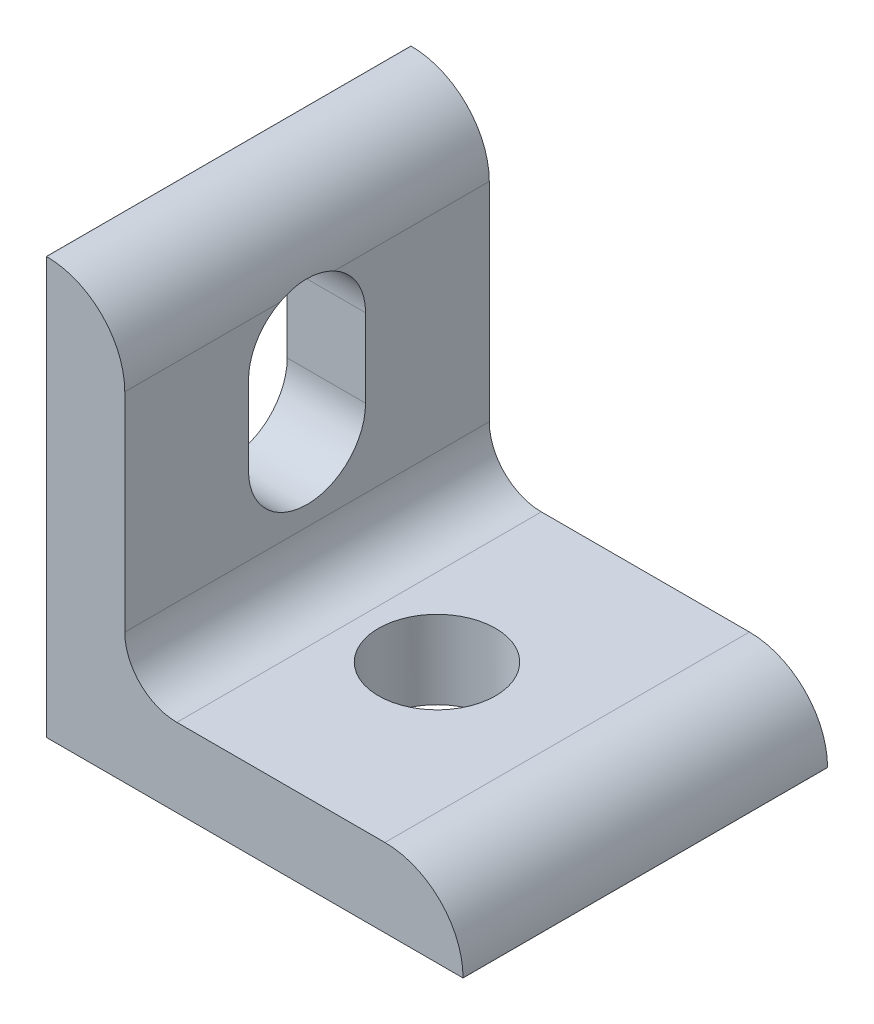
ISO-10303-21;
HEADER;
FILE_DESCRIPTION(('STEP AP214'),'2;1');
FILE_NAME('part.step','',(''),(''),'','','');
FILE_SCHEMA(('AUTOMOTIVE_DESIGN { 1 0 10303 214 1 1 1 1 }'));
ENDSEC;
DATA;
#1=APPLICATION_CONTEXT('core data for automotive mechanical design processes');
#2=APPLICATION_PROTOCOL_DEFINITION('international standard','automotive_design',2000,#1);
#3=PRODUCT_CONTEXT('',#1,'mechanical');
#4=PRODUCT('Part','Part','',(#3));
#5=PRODUCT_RELATED_PRODUCT_CATEGORY('part','',(#4));
#6=PRODUCT_DEFINITION_FORMATION('','',#4);
#7=PRODUCT_DEFINITION_CONTEXT('part definition',#1,'design');
#8=PRODUCT_DEFINITION('design','',#6,#7);
#9=PRODUCT_DEFINITION_SHAPE('','',#8);
#10=(LENGTH_UNIT() NAMED_UNIT(*) SI_UNIT(.MILLI.,.METRE.));
#11=(NAMED_UNIT(*) PLANE_ANGLE_UNIT() SI_UNIT($,.RADIAN.));
#12=(NAMED_UNIT(*) SI_UNIT($,.STERADIAN.) SOLID_ANGLE_UNIT());
#13=UNCERTAINTY_MEASURE_WITH_UNIT(LENGTH_MEASURE(1.E-05),#10,'distance_accuracy_value','');
#14=(GEOMETRIC_REPRESENTATION_CONTEXT(3) GLOBAL_UNCERTAINTY_ASSIGNED_CONTEXT((#13)) GLOBAL_UNIT_ASSIGNED_CONTEXT((#10,
#11,#12)) REPRESENTATION_CONTEXT('',''));
#15=CARTESIAN_POINT('',(0.,0.,0.));
#16=DIRECTION('',(0.,0.,1.));
#17=DIRECTION('',(1.,0.,0.));
#18=AXIS2_PLACEMENT_3D('',#15,#16,#17);
#19=CARTESIAN_POINT('',(25.4,0.,11.1125));
#20=DIRECTION('',(0.,1.,0.));
#21=DIRECTION('',(-1.,0.,0.));
#22=AXIS2_PLACEMENT_3D('',#19,#20,#21);
#23=PLANE('',#22);
#24=CARTESIAN_POINT('',(12.7,0.,0.));
#25=DIRECTION('',(0.,-1.,0.));
#26=DIRECTION('',(1.,0.,0.));
#27=AXIS2_PLACEMENT_3D('',#24,#25,#26);
#28=CIRCLE('',#27,3.5687);
#29=CARTESIAN_POINT('',(16.2687,0.,0.));
#30=VERTEX_POINT('',#29);
#31=EDGE_CURVE('E215',#30,#30,#28,.T.);
#32=ORIENTED_EDGE('',*,*,#31,.F.);
#33=EDGE_LOOP('',(#32));
#34=FACE_BOUND('',#33,.T.);
#35=DIRECTION('',(1.,0.,0.));
#36=VECTOR('',#35,1.);
#37=CARTESIAN_POINT('',(25.4,0.,-11.1125));
#38=LINE('',#37,#36);
#39=CARTESIAN_POINT('',(0.,0.,-11.1125));
#40=VERTEX_POINT('',#39);
#41=CARTESIAN_POINT('',(25.4,0.,-11.1125));
#42=VERTEX_POINT('',#41);
#43=EDGE_CURVE('E182',#40,#42,#38,.T.);
#44=ORIENTED_EDGE('',*,*,#43,.T.);
#45=DIRECTION('',(0.,0.,-1.));
#46=VECTOR('',#45,1.);
#47=CARTESIAN_POINT('',(25.4,0.,11.1125));
#48=LINE('',#47,#46);
#49=CARTESIAN_POINT('',(25.4,0.,11.1125));
#50=VERTEX_POINT('',#49);
#51=EDGE_CURVE('E11',#50,#42,#48,.T.);
#52=ORIENTED_EDGE('',*,*,#51,.F.);
#53=DIRECTION('',(1.,0.,0.));
#54=VECTOR('',#53,1.);
#55=CARTESIAN_POINT('',(25.4,0.,11.1125));
#56=LINE('',#55,#54);
#57=CARTESIAN_POINT('',(0.,0.,11.1125));
#58=VERTEX_POINT('',#57);
#59=EDGE_CURVE('E183',#58,#50,#56,.T.);
#60=ORIENTED_EDGE('',*,*,#59,.F.);
#61=DIRECTION('',(0.,0.,-1.));
#62=VECTOR('',#61,1.);
#63=CARTESIAN_POINT('',(0.,0.,11.1125));
#64=LINE('',#63,#62);
#65=EDGE_CURVE('E222',#58,#40,#64,.T.);
#66=ORIENTED_EDGE('',*,*,#65,.T.);
#67=EDGE_LOOP('',(#44,#52,#60,#66));
#68=FACE_BOUND('',#67,.T.);
#69=ADVANCED_FACE('F34',(#34,#68),#23,.F.);
#70=CARTESIAN_POINT('',(25.4,0.0126999999999636,11.1125));
#71=DIRECTION('',(-1.,0.,0.));
#72=DIRECTION('',(0.,0.,1.));
#73=AXIS2_PLACEMENT_3D('',#70,#71,#72);
#74=PLANE('',#73);
#75=DIRECTION('',(0.,1.,0.));
#76=VECTOR('',#75,1.);
#77=CARTESIAN_POINT('',(25.4,0.0126999999999636,-11.1125));
#78=LINE('',#77,#76);
#79=CARTESIAN_POINT('',(25.4,0.0126999999999642,-11.1125));
#80=VERTEX_POINT('',#79);
#81=EDGE_CURVE('E225',#42,#80,#78,.T.);
#82=ORIENTED_EDGE('',*,*,#81,.T.);
#83=DIRECTION('',(0.,0.,-1.));
#84=VECTOR('',#83,1.);
#85=CARTESIAN_POINT('',(25.4,0.0126999999999642,11.1125));
#86=LINE('',#85,#84);
#87=CARTESIAN_POINT('',(25.4,0.0126999999999642,11.1125));
#88=VERTEX_POINT('',#87);
#89=EDGE_CURVE('E42',#88,#80,#86,.T.);
#90=ORIENTED_EDGE('',*,*,#89,.F.);
#91=DIRECTION('',(0.,1.,0.));
#92=VECTOR('',#91,1.);
#93=CARTESIAN_POINT('',(25.4,0.0126999999999636,11.1125));
#94=LINE('',#93,#92);
#95=EDGE_CURVE('E303',#50,#88,#94,.T.);
#96=ORIENTED_EDGE('',*,*,#95,.F.);
#97=ORIENTED_EDGE('',*,*,#51,.T.);
#98=EDGE_LOOP('',(#82,#90,#96,#97));
#99=FACE_BOUND('',#98,.T.);
#100=ADVANCED_FACE('F205',(#99),#74,.F.);
#101=CARTESIAN_POINT('',(20.6375,0.0126999999999974,11.1125));
#102=DIRECTION('',(0.,0.,-1.));
#103=DIRECTION('',(-1.,0.,0.));
#104=AXIS2_PLACEMENT_3D('',#101,#102,#103);
#105=CYLINDRICAL_SURFACE('',#104,4.7625);
#106=CARTESIAN_POINT('',(20.6375,0.0126999999999974,-11.1125));
#107=DIRECTION('',(0.,0.,1.));
#108=DIRECTION('',(-1.,0.,0.));
#109=AXIS2_PLACEMENT_3D('',#106,#107,#108);
#110=CIRCLE('',#109,4.7625);
#111=CARTESIAN_POINT('',(20.6375,4.7752,-11.1125));
#112=VERTEX_POINT('',#111);
#113=EDGE_CURVE('E227',#80,#112,#110,.T.);
#114=ORIENTED_EDGE('',*,*,#113,.T.);
#115=DIRECTION('',(0.,0.,-1.));
#116=VECTOR('',#115,1.);
#117=CARTESIAN_POINT('',(20.6375,4.7752,11.1125));
#118=LINE('',#117,#116);
#119=CARTESIAN_POINT('',(20.6375,4.7752,11.1125));
#120=VERTEX_POINT('',#119);
#121=EDGE_CURVE('E262',#120,#112,#118,.T.);
#122=ORIENTED_EDGE('',*,*,#121,.F.);
#123=CARTESIAN_POINT('',(20.6375,0.0126999999999974,11.1125));
#124=DIRECTION('',(0.,0.,1.));
#125=DIRECTION('',(-1.,0.,0.));
#126=AXIS2_PLACEMENT_3D('',#123,#124,#125);
#127=CIRCLE('',#126,4.7625);
#128=EDGE_CURVE('E271',#88,#120,#127,.T.);
#129=ORIENTED_EDGE('',*,*,#128,.F.);
#130=ORIENTED_EDGE('',*,*,#89,.T.);
#131=EDGE_LOOP('',(#114,#122,#129,#130));
#132=FACE_BOUND('',#131,.T.);
#133=ADVANCED_FACE('F210',(#132),#105,.T.);
#134=CARTESIAN_POINT('',(7.9502,4.7752,11.1125));
#135=DIRECTION('',(0.,-1.,0.));
#136=DIRECTION('',(0.,0.,-1.));
#137=AXIS2_PLACEMENT_3D('',#134,#135,#136);
#138=PLANE('',#137);
#139=CARTESIAN_POINT('',(12.7,4.7752,0.));
#140=DIRECTION('',(0.,-1.,0.));
#141=DIRECTION('',(0.,0.,-1.));
#142=AXIS2_PLACEMENT_3D('',#139,#140,#141);
#143=CIRCLE('',#142,3.5687);
#144=CARTESIAN_POINT('',(12.7,4.7752,-3.5687));
#145=VERTEX_POINT('',#144);
#146=EDGE_CURVE('E37',#145,#145,#143,.T.);
#147=ORIENTED_EDGE('',*,*,#146,.T.);
#148=EDGE_LOOP('',(#147));
#149=FACE_BOUND('',#148,.T.);
#150=DIRECTION('',(-1.,0.,0.));
#151=VECTOR('',#150,1.);
#152=CARTESIAN_POINT('',(7.9502,4.7752,-11.1125));
#153=LINE('',#152,#151);
#154=CARTESIAN_POINT('',(7.9502,4.7752,-11.1125));
#155=VERTEX_POINT('',#154);
#156=EDGE_CURVE('E234',#112,#155,#153,.T.);
#157=ORIENTED_EDGE('',*,*,#156,.T.);
#158=DIRECTION('',(0.,0.,-1.));
#159=VECTOR('',#158,1.);
#160=CARTESIAN_POINT('',(7.9502,4.7752,11.1125));
#161=LINE('',#160,#159);
#162=CARTESIAN_POINT('',(7.9502,4.7752,11.1125));
#163=VERTEX_POINT('',#162);
#164=EDGE_CURVE('E259',#163,#155,#161,.T.);
#165=ORIENTED_EDGE('',*,*,#164,.F.);
#166=DIRECTION('',(-1.,0.,0.));
#167=VECTOR('',#166,1.);
#168=CARTESIAN_POINT('',(7.9502,4.7752,11.1125));
#169=LINE('',#168,#167);
#170=EDGE_CURVE('E288',#120,#163,#169,.T.);
#171=ORIENTED_EDGE('',*,*,#170,.F.);
#172=ORIENTED_EDGE('',*,*,#121,.T.);
#173=EDGE_LOOP('',(#157,#165,#171,#172));
#174=FACE_BOUND('',#173,.T.);
#175=ADVANCED_FACE('F278',(#149,#174),#138,.F.);
#176=CARTESIAN_POINT('',(7.9502,7.9502,11.1125));
#177=DIRECTION('',(0.,0.,-1.));
#178=DIRECTION('',(-1.,0.,0.));
#179=AXIS2_PLACEMENT_3D('',#176,#177,#178);
#180=CYLINDRICAL_SURFACE('',#179,3.175);
#181=CARTESIAN_POINT('',(7.9502,7.9502,-11.1125));
#182=DIRECTION('',(0.,0.,-1.));
#183=DIRECTION('',(1.,0.,0.));
#184=AXIS2_PLACEMENT_3D('',#181,#182,#183);
#185=CIRCLE('',#184,3.175);
#186=CARTESIAN_POINT('',(4.7752,7.9502,-11.1125));
#187=VERTEX_POINT('',#186);
#188=EDGE_CURVE('E236',#155,#187,#185,.T.);
#189=ORIENTED_EDGE('',*,*,#188,.T.);
#190=DIRECTION('',(0.,0.,-1.));
#191=VECTOR('',#190,1.);
#192=CARTESIAN_POINT('',(4.7752,7.9502,11.1125));
#193=LINE('',#192,#191);
#194=CARTESIAN_POINT('',(4.7752,7.9502,11.1125));
#195=VERTEX_POINT('',#194);
#196=EDGE_CURVE('E256',#195,#187,#193,.T.);
#197=ORIENTED_EDGE('',*,*,#196,.F.);
#198=CARTESIAN_POINT('',(7.9502,7.9502,11.1125));
#199=DIRECTION('',(0.,0.,-1.));
#200=DIRECTION('',(1.,0.,0.));
#201=AXIS2_PLACEMENT_3D('',#198,#199,#200);
#202=CIRCLE('',#201,3.175);
#203=EDGE_CURVE('E284',#163,#195,#202,.T.);
#204=ORIENTED_EDGE('',*,*,#203,.F.);
#205=ORIENTED_EDGE('',*,*,#164,.T.);
#206=EDGE_LOOP('',(#189,#197,#204,#205));
#207=FACE_BOUND('',#206,.T.);
#208=ADVANCED_FACE('F282',(#207),#180,.F.);
#209=CARTESIAN_POINT('',(4.77519999999999,20.6375,11.1125));
#210=DIRECTION('',(-1.,0.,0.));
#211=DIRECTION('',(0.,-1.,0.));
#212=AXIS2_PLACEMENT_3D('',#209,#210,#211);
#213=PLANE('',#212);
#214=DIRECTION('',(0.,-1.,0.));
#215=VECTOR('',#214,1.);
#216=CARTESIAN_POINT('',(4.77519999999999,17.4752,3.5687));
#217=LINE('',#216,#215);
#218=CARTESIAN_POINT('',(4.77519999999999,17.4752,3.5687));
#219=VERTEX_POINT('',#218);
#220=CARTESIAN_POINT('',(4.77519999999999,12.7,3.5687));
#221=VERTEX_POINT('',#220);
#222=EDGE_CURVE('E156',#219,#221,#217,.T.);
#223=ORIENTED_EDGE('',*,*,#222,.F.);
#224=CARTESIAN_POINT('',(4.77519999999999,17.4752,0.));
#225=DIRECTION('',(-1.,0.,0.));
#226=DIRECTION('',(0.,-1.,0.));
#227=AXIS2_PLACEMENT_3D('',#224,#225,#226);
#228=CIRCLE('',#227,3.5687);
#229=CARTESIAN_POINT('',(4.77519999999999,20.6375,1.6539281725638));
#230=VERTEX_POINT('',#229);
#231=EDGE_CURVE('E155',#230,#219,#228,.F.);
#232=ORIENTED_EDGE('',*,*,#231,.F.);
#233=DIRECTION('',(0.,0.,-1.));
#234=VECTOR('',#233,1.);
#235=CARTESIAN_POINT('',(4.77519999999999,20.6375,11.1125));
#236=LINE('',#235,#234);
#237=CARTESIAN_POINT('',(4.77519999999999,20.6375,11.1125));
#238=VERTEX_POINT('',#237);
#239=EDGE_CURVE('E253',#238,#230,#236,.T.);
#240=ORIENTED_EDGE('',*,*,#239,.F.);
#241=DIRECTION('',(0.,1.,0.));
#242=VECTOR('',#241,1.);
#243=CARTESIAN_POINT('',(4.77519999999999,20.6375,11.1125));
#244=LINE('',#243,#242);
#245=EDGE_CURVE('E287',#195,#238,#244,.T.);
#246=ORIENTED_EDGE('',*,*,#245,.F.);
#247=ORIENTED_EDGE('',*,*,#196,.T.);
#248=DIRECTION('',(0.,1.,0.));
#249=VECTOR('',#248,1.);
#250=CARTESIAN_POINT('',(4.77519999999999,20.6375,-11.1125));
#251=LINE('',#250,#249);
#252=CARTESIAN_POINT('',(4.77519999999999,20.6375,-11.1125));
#253=VERTEX_POINT('',#252);
#254=EDGE_CURVE('E238',#187,#253,#251,.T.);
#255=ORIENTED_EDGE('',*,*,#254,.T.);
#256=CARTESIAN_POINT('',(4.77519999999999,20.6375,-1.6539281725638));
#257=VERTEX_POINT('',#256);
#258=EDGE_CURVE('E154',#257,#253,#236,.T.);
#259=ORIENTED_EDGE('',*,*,#258,.F.);
#260=CARTESIAN_POINT('',(4.77519999999999,17.4752,-3.5687));
#261=VERTEX_POINT('',#260);
#262=EDGE_CURVE('E49',#261,#257,#228,.F.);
#263=ORIENTED_EDGE('',*,*,#262,.F.);
#264=DIRECTION('',(0.,1.,0.));
#265=VECTOR('',#264,1.);
#266=CARTESIAN_POINT('',(4.77519999999999,17.4752,-3.5687));
#267=LINE('',#266,#265);
#268=CARTESIAN_POINT('',(4.77519999999999,12.7,-3.5687));
#269=VERTEX_POINT('',#268);
#270=EDGE_CURVE('E142',#269,#261,#267,.T.);
#271=ORIENTED_EDGE('',*,*,#270,.F.);
#272=CARTESIAN_POINT('',(4.77519999999999,12.7,0.));
#273=DIRECTION('',(-1.,0.,0.));
#274=DIRECTION('',(0.,-1.,0.));
#275=AXIS2_PLACEMENT_3D('',#272,#273,#274);
#276=CIRCLE('',#275,3.5687);
#277=EDGE_CURVE('E159',#221,#269,#276,.F.);
#278=ORIENTED_EDGE('',*,*,#277,.F.);
#279=EDGE_LOOP('',(#223,#232,#240,#246,#247,#255,#259,#263,#271,#278));
#280=FACE_BOUND('',#279,.T.);
#281=ADVANCED_FACE('F152',(#280),#213,.F.);
#282=CARTESIAN_POINT('',(0.0126999999999922,20.6375,11.1125));
#283=DIRECTION('',(0.,0.,-1.));
#284=DIRECTION('',(-1.,0.,0.));
#285=AXIS2_PLACEMENT_3D('',#282,#283,#284);
#286=CYLINDRICAL_SURFACE('',#285,4.7625);
#287=ORIENTED_EDGE('',*,*,#239,.T.);
#288=CARTESIAN_POINT('',(3.57377637660301,17.4752,-3.5687));
#289=CARTESIAN_POINT('',(3.63518581837124,17.5443309223393,-3.56870607156327));
#290=CARTESIAN_POINT('',(3.69457954480555,17.6152918401586,-3.56669100177077));
#291=CARTESIAN_POINT('',(3.8090593210143,17.7604227445082,-3.55802557360325));
#292=CARTESIAN_POINT('',(3.86414191136109,17.8345952354904,-3.55137153430278));
#293=CARTESIAN_POINT('',(3.96975518057589,17.985773864542,-3.53281032128466));
#294=CARTESIAN_POINT('',(4.02027424989692,18.0627865646794,-3.52089018016444));
#295=CARTESIAN_POINT('',(4.11630482257368,18.2187778387752,-3.49127639625316));
#296=CARTESIAN_POINT('',(4.16181769974699,18.2977558660694,-3.47358434272357));
#297=CARTESIAN_POINT('',(4.24786643649431,18.4573542271587,-3.43188453562559));
#298=CARTESIAN_POINT('',(4.28837334203518,18.5379812331985,-3.4078423533904));
#299=CARTESIAN_POINT('',(4.36398457801989,18.6995415784743,-3.35318922513051));
#300=CARTESIAN_POINT('',(4.39908922452246,18.7804748995053,-3.32257866363935));
#301=CARTESIAN_POINT('',(4.46382574483582,18.9415046670517,-3.25471755199295));
#302=CARTESIAN_POINT('',(4.49346967338884,19.021602579563,-3.21748199314413));
#303=CARTESIAN_POINT('',(4.54752011664702,19.1801636613109,-3.13634333715154));
#304=CARTESIAN_POINT('',(4.57192704012919,19.2586269577062,-3.09244076086228));
#305=CARTESIAN_POINT('',(4.61407574135526,19.4069630311146,-3.00180998643521));
#306=CARTESIAN_POINT('',(4.63218883963144,19.4770285861497,-2.95556905617311));
#307=CARTESIAN_POINT('',(4.66452434197863,19.6143100632684,-2.85778676220225));
#308=CARTESIAN_POINT('',(4.6787454864123,19.6815250568292,-2.80624368985506));
#309=CARTESIAN_POINT('',(4.71614197329389,19.8780324356924,-2.64401156529126));
#310=CARTESIAN_POINT('',(4.73404945759461,20.0021838342117,-2.52572166128483));
#311=CARTESIAN_POINT('',(4.75976382492475,20.2360945537126,-2.26811317830166));
#312=CARTESIAN_POINT('',(4.76724397735651,20.3452954892949,-2.12826079554485));
#313=CARTESIAN_POINT('',(4.77525485098986,20.5418193467477,-1.83379621030593));
#314=CARTESIAN_POINT('',(4.77578469739021,20.6291395132355,-1.67918215231037));
#315=CARTESIAN_POINT('',(4.77357437662458,20.7868759666154,-1.34382358661879));
#316=CARTESIAN_POINT('',(4.77052603906853,20.854970109777,-1.16198579942832));
#317=CARTESIAN_POINT('',(4.76450981975162,20.9608171297749,-0.789663968707559));
#318=CARTESIAN_POINT('',(4.76154195480036,20.9985637138968,-0.599178140610173));
#319=CARTESIAN_POINT('',(4.75792192189026,21.0434948696388,-0.207608715679166));
#320=CARTESIAN_POINT('',(4.75735720353918,21.0495271556727,-0.00639076397234385));
#321=CARTESIAN_POINT('',(4.75919707493683,21.0277293247021,0.394199309625806));
#322=CARTESIAN_POINT('',(4.76160188632756,20.9998966800638,0.593571292617267));
#323=CARTESIAN_POINT('',(4.76752754579461,20.9113045295213,0.98431506232508));
#324=CARTESIAN_POINT('',(4.77104577577146,20.8506220315023,1.17570443647262));
#325=CARTESIAN_POINT('',(4.77542469167632,20.6979508834394,1.54580119694159));
#326=CARTESIAN_POINT('',(4.77628477018654,20.6059550832812,1.72450567550658));
#327=CARTESIAN_POINT('',(4.77166883221865,20.4466490007958,1.97893517680256));
#328=CARTESIAN_POINT('',(4.76914207015819,20.3899485756795,2.06152589841516));
#329=CARTESIAN_POINT('',(4.76137206689036,20.2698845847618,2.22156314613365));
#330=CARTESIAN_POINT('',(4.75613000995688,20.2065239334083,2.29901189830536));
#331=CARTESIAN_POINT('',(4.7421830508449,20.0737182342447,2.44811999641552));
#332=CARTESIAN_POINT('',(4.73347935096919,20.0042753054631,2.51978134205881));
#333=CARTESIAN_POINT('',(4.71186925223778,19.8599825797467,2.6567502617054));
#334=CARTESIAN_POINT('',(4.69896322416163,19.7851332602816,2.72205839560489));
#335=CARTESIAN_POINT('',(4.66924499637256,19.63579422726,2.84183433195763));
#336=CARTESIAN_POINT('',(4.65273429661973,19.5615858317822,2.89672780306087));
#337=CARTESIAN_POINT('',(4.6149520420999,19.4099888414942,3.00010465235614));
#338=CARTESIAN_POINT('',(4.59368094027209,19.332600549814,3.04858863969527));
#339=CARTESIAN_POINT('',(4.54601698937911,19.1755965546273,3.13886305976829));
#340=CARTESIAN_POINT('',(4.51962759017398,19.0959823821828,3.18065796666884));
#341=CARTESIAN_POINT('',(4.4615020825125,18.9354808093763,3.25747284652476));
#342=CARTESIAN_POINT('',(4.42976635839609,18.8545935009171,3.29249330609734));
#343=CARTESIAN_POINT('',(4.33215175530288,18.6251298776576,3.38209670962556));
#344=CARTESIAN_POINT('',(4.25980236009356,18.4761149284383,3.42877935129588));
#345=CARTESIAN_POINT('',(4.09730995333731,18.1828050280342,3.50111519235862));
#346=CARTESIAN_POINT('',(4.0071585219334,18.03851234814,3.52675841100278));
#347=CARTESIAN_POINT('',(3.85732172820636,17.8253072902077,3.55226145206908));
#348=CARTESIAN_POINT('',(3.80337120408007,17.7529955113679,3.55857901052661));
#349=CARTESIAN_POINT('',(3.69150588424526,17.6116291119481,3.56679093171781));
#350=CARTESIAN_POINT('',(3.63360483071157,17.5425644835647,3.56869989576642));
#351=CARTESIAN_POINT('',(3.57377637660301,17.4752,3.5687));
#352=B_SPLINE_CURVE_WITH_KNOTS('',3,(#288,#289,#290,#291,#292,#293,#294,#295,#296,#297,#298,
#299,#300,#301,#302,#303,#304,#305,#306,#307,#308,#309,#310,#311,#312,#313,#314,#315,#316,#317,
#318,#319,#320,#321,#322,#323,#324,#325,#326,#327,#328,#329,#330,#331,#332,#333,#334,#335,#336,
#337,#338,#339,#340,#341,#342,#343,#344,#345,#346,#347,#348,#349,#350,#351),.UNSPECIFIED.,.F.,
.F.,(4,2,2,2,2,2,2,2,2,2,2,2,2,2,2,2,2,2,2,2,2,2,2,2,2,2,2,2,2,2,2,4),(0.,0.277384759004351,
0.554989867901281,0.833282403352699,1.11149837720417,1.39125488041906,1.67099501027581,
1.95011000246348,2.22920320026044,2.48653387712389,2.74394774125849,3.25878751192653,
3.78942203851392,4.3201233528493,4.90009741041192,5.48019169742969,6.08122399358563,
6.68230115275203,7.28197530743777,7.8817864843505,8.18210534985957,8.48229334166496,
8.78237716266801,9.08243451386547,9.36336155434783,9.6442618767493,9.92497351920576,
10.2056649902926,10.7194145543901,11.2334076919532,11.5045091584489,11.774711438085),.UNSPECIFIED.);
#353=EDGE_CURVE('E147',#257,#230,#352,.T.);
#354=ORIENTED_EDGE('',*,*,#353,.F.);
#355=ORIENTED_EDGE('',*,*,#258,.T.);
#356=CARTESIAN_POINT('',(0.0126999999999922,20.6375,-11.1125));
#357=DIRECTION('',(0.,0.,1.));
#358=DIRECTION('',(1.,0.,0.));
#359=AXIS2_PLACEMENT_3D('',#356,#357,#358);
#360=CIRCLE('',#359,4.7625);
#361=CARTESIAN_POINT('',(0.0126999999999584,25.4,-11.1125));
#362=VERTEX_POINT('',#361);
#363=EDGE_CURVE('E240',#253,#362,#360,.T.);
#364=ORIENTED_EDGE('',*,*,#363,.T.);
#365=DIRECTION('',(0.,0.,-1.));
#366=VECTOR('',#365,1.);
#367=CARTESIAN_POINT('',(0.0126999999999584,25.4,11.1125));
#368=LINE('',#367,#366);
#369=CARTESIAN_POINT('',(0.0126999999999584,25.4,11.1125));
#370=VERTEX_POINT('',#369);
#371=EDGE_CURVE('E250',#370,#362,#368,.T.);
#372=ORIENTED_EDGE('',*,*,#371,.F.);
#373=CARTESIAN_POINT('',(0.0126999999999922,20.6375,11.1125));
#374=DIRECTION('',(0.,0.,1.));
#375=DIRECTION('',(1.,0.,0.));
#376=AXIS2_PLACEMENT_3D('',#373,#374,#375);
#377=CIRCLE('',#376,4.7625);
#378=EDGE_CURVE('E290',#238,#370,#377,.T.);
#379=ORIENTED_EDGE('',*,*,#378,.F.);
#380=EDGE_LOOP('',(#287,#354,#355,#364,#372,#379));
#381=FACE_BOUND('',#380,.T.);
#382=ADVANCED_FACE('F311',(#381),#286,.T.);
#383=CARTESIAN_POINT('',(0.,25.4,11.1125));
#384=DIRECTION('',(0.,-1.,0.));
#385=DIRECTION('',(0.,0.,-1.));
#386=AXIS2_PLACEMENT_3D('',#383,#384,#385);
#387=PLANE('',#386);
#388=DIRECTION('',(-1.,0.,0.));
#389=VECTOR('',#388,1.);
#390=CARTESIAN_POINT('',(0.,25.4,-11.1125));
#391=LINE('',#390,#389);
#392=CARTESIAN_POINT('',(0.,25.4,-11.1125));
#393=VERTEX_POINT('',#392);
#394=EDGE_CURVE('E242',#362,#393,#391,.T.);
#395=ORIENTED_EDGE('',*,*,#394,.T.);
#396=DIRECTION('',(0.,0.,-1.));
#397=VECTOR('',#396,1.);
#398=CARTESIAN_POINT('',(0.,25.4,11.1125));
#399=LINE('',#398,#397);
#400=CARTESIAN_POINT('',(0.,25.4,11.1125));
#401=VERTEX_POINT('',#400);
#402=EDGE_CURVE('E247',#401,#393,#399,.T.);
#403=ORIENTED_EDGE('',*,*,#402,.F.);
#404=DIRECTION('',(-1.,0.,0.));
#405=VECTOR('',#404,1.);
#406=CARTESIAN_POINT('',(0.,25.4,11.1125));
#407=LINE('',#406,#405);
#408=EDGE_CURVE('E295',#370,#401,#407,.T.);
#409=ORIENTED_EDGE('',*,*,#408,.F.);
#410=ORIENTED_EDGE('',*,*,#371,.T.);
#411=EDGE_LOOP('',(#395,#403,#409,#410));
#412=FACE_BOUND('',#411,.T.);
#413=ADVANCED_FACE('F307',(#412),#387,.F.);
#414=CARTESIAN_POINT('',(0.,0.,11.1125));
#415=DIRECTION('',(1.,0.,0.));
#416=DIRECTION('',(0.,1.,0.));
#417=AXIS2_PLACEMENT_3D('',#414,#415,#416);
#418=PLANE('',#417);
#419=DIRECTION('',(0.,-1.,0.));
#420=VECTOR('',#419,1.);
#421=CARTESIAN_POINT('',(0.,17.4752,-3.5687));
#422=LINE('',#421,#420);
#423=CARTESIAN_POINT('',(0.,17.4752,-3.5687));
#424=VERTEX_POINT('',#423);
#425=CARTESIAN_POINT('',(0.,12.7,-3.5687));
#426=VERTEX_POINT('',#425);
#427=EDGE_CURVE('E164',#424,#426,#422,.T.);
#428=ORIENTED_EDGE('',*,*,#427,.F.);
#429=CARTESIAN_POINT('',(0.,17.4752,0.));
#430=DIRECTION('',(-1.,0.,0.));
#431=DIRECTION('',(0.,-1.,0.));
#432=AXIS2_PLACEMENT_3D('',#429,#430,#431);
#433=CIRCLE('',#432,3.5687);
#434=CARTESIAN_POINT('',(0.,17.4752,3.5687));
#435=VERTEX_POINT('',#434);
#436=EDGE_CURVE('E55',#435,#424,#433,.T.);
#437=ORIENTED_EDGE('',*,*,#436,.F.);
#438=DIRECTION('',(0.,1.,0.));
#439=VECTOR('',#438,1.);
#440=CARTESIAN_POINT('',(0.,17.4752,3.5687));
#441=LINE('',#440,#439);
#442=CARTESIAN_POINT('',(0.,12.7,3.5687));
#443=VERTEX_POINT('',#442);
#444=EDGE_CURVE('E139',#443,#435,#441,.T.);
#445=ORIENTED_EDGE('',*,*,#444,.F.);
#446=CARTESIAN_POINT('',(0.,12.7,0.));
#447=DIRECTION('',(-1.,0.,0.));
#448=DIRECTION('',(0.,-1.,0.));
#449=AXIS2_PLACEMENT_3D('',#446,#447,#448);
#450=CIRCLE('',#449,3.5687);
#451=EDGE_CURVE('E166',#426,#443,#450,.T.);
#452=ORIENTED_EDGE('',*,*,#451,.F.);
#453=EDGE_LOOP('',(#428,#437,#445,#452));
#454=FACE_BOUND('',#453,.T.);
#455=DIRECTION('',(0.,-1.,0.));
#456=VECTOR('',#455,1.);
#457=CARTESIAN_POINT('',(0.,0.,-11.1125));
#458=LINE('',#457,#456);
#459=EDGE_CURVE('E244',#393,#40,#458,.T.);
#460=ORIENTED_EDGE('',*,*,#459,.T.);
#461=ORIENTED_EDGE('',*,*,#65,.F.);
#462=DIRECTION('',(0.,-1.,0.));
#463=VECTOR('',#462,1.);
#464=CARTESIAN_POINT('',(0.,0.,11.1125));
#465=LINE('',#464,#463);
#466=EDGE_CURVE('E230',#401,#58,#465,.T.);
#467=ORIENTED_EDGE('',*,*,#466,.F.);
#468=ORIENTED_EDGE('',*,*,#402,.T.);
#469=EDGE_LOOP('',(#460,#461,#467,#468));
#470=FACE_BOUND('',#469,.T.);
#471=ADVANCED_FACE('F302',(#454,#470),#418,.F.);
#472=CARTESIAN_POINT('',(0.0126999999999922,20.6375,11.1125));
#473=DIRECTION('',(0.,0.,1.));
#474=DIRECTION('',(1.,0.,0.));
#475=AXIS2_PLACEMENT_3D('',#472,#473,#474);
#476=PLANE('',#475);
#477=ORIENTED_EDGE('',*,*,#59,.T.);
#478=ORIENTED_EDGE('',*,*,#95,.T.);
#479=ORIENTED_EDGE('',*,*,#128,.T.);
#480=ORIENTED_EDGE('',*,*,#170,.T.);
#481=ORIENTED_EDGE('',*,*,#203,.T.);
#482=ORIENTED_EDGE('',*,*,#245,.T.);
#483=ORIENTED_EDGE('',*,*,#378,.T.);
#484=ORIENTED_EDGE('',*,*,#408,.T.);
#485=ORIENTED_EDGE('',*,*,#466,.T.);
#486=EDGE_LOOP('',(#477,#478,#479,#480,#481,#482,#483,#484,#485));
#487=FACE_BOUND('',#486,.T.);
#488=ADVANCED_FACE('F300',(#487),#476,.T.);
#489=CARTESIAN_POINT('',(0.0126999999999922,20.6375,-11.1125));
#490=DIRECTION('',(0.,0.,1.));
#491=DIRECTION('',(1.,0.,0.));
#492=AXIS2_PLACEMENT_3D('',#489,#490,#491);
#493=PLANE('',#492);
#494=ORIENTED_EDGE('',*,*,#43,.F.);
#495=ORIENTED_EDGE('',*,*,#459,.F.);
#496=ORIENTED_EDGE('',*,*,#394,.F.);
#497=ORIENTED_EDGE('',*,*,#363,.F.);
#498=ORIENTED_EDGE('',*,*,#254,.F.);
#499=ORIENTED_EDGE('',*,*,#188,.F.);
#500=ORIENTED_EDGE('',*,*,#156,.F.);
#501=ORIENTED_EDGE('',*,*,#113,.F.);
#502=ORIENTED_EDGE('',*,*,#81,.F.);
#503=EDGE_LOOP('',(#494,#495,#496,#497,#498,#499,#500,#501,#502));
#504=FACE_BOUND('',#503,.T.);
#505=ADVANCED_FACE('F273',(#504),#493,.F.);
#506=CARTESIAN_POINT('',(25.401,17.4752,0.));
#507=DIRECTION('',(-1.,0.,0.));
#508=DIRECTION('',(0.,-1.,0.));
#509=AXIS2_PLACEMENT_3D('',#506,#507,#508);
#510=CYLINDRICAL_SURFACE('',#509,3.5687);
#511=ORIENTED_EDGE('',*,*,#231,.T.);
#512=DIRECTION('',(-1.,0.,0.));
#513=VECTOR('',#512,1.);
#514=CARTESIAN_POINT('',(25.401,17.4752,3.5687));
#515=LINE('',#514,#513);
#516=EDGE_CURVE('E148',#219,#435,#515,.T.);
#517=ORIENTED_EDGE('',*,*,#516,.T.);
#518=ORIENTED_EDGE('',*,*,#436,.T.);
#519=DIRECTION('',(-1.,0.,0.));
#520=VECTOR('',#519,1.);
#521=CARTESIAN_POINT('',(25.401,17.4752,-3.5687));
#522=LINE('',#521,#520);
#523=EDGE_CURVE('E131',#261,#424,#522,.T.);
#524=ORIENTED_EDGE('',*,*,#523,.F.);
#525=ORIENTED_EDGE('',*,*,#262,.T.);
#526=ORIENTED_EDGE('',*,*,#353,.T.);
#527=EDGE_LOOP('',(#511,#517,#518,#524,#525,#526));
#528=FACE_BOUND('',#527,.T.);
#529=ADVANCED_FACE('F134',(#528),#510,.F.);
#530=CARTESIAN_POINT('',(25.401,17.4752,3.5687));
#531=DIRECTION('',(0.,0.,1.));
#532=DIRECTION('',(1.,0.,0.));
#533=AXIS2_PLACEMENT_3D('',#530,#531,#532);
#534=PLANE('',#533);
#535=ORIENTED_EDGE('',*,*,#222,.T.);
#536=DIRECTION('',(-1.,0.,0.));
#537=VECTOR('',#536,1.);
#538=CARTESIAN_POINT('',(25.401,12.7,3.5687));
#539=LINE('',#538,#537);
#540=EDGE_CURVE('E172',#221,#443,#539,.T.);
#541=ORIENTED_EDGE('',*,*,#540,.T.);
#542=ORIENTED_EDGE('',*,*,#444,.T.);
#543=ORIENTED_EDGE('',*,*,#516,.F.);
#544=EDGE_LOOP('',(#535,#541,#542,#543));
#545=FACE_BOUND('',#544,.T.);
#546=ADVANCED_FACE('F192',(#545),#534,.F.);
#547=CARTESIAN_POINT('',(25.401,12.7,0.));
#548=DIRECTION('',(-1.,0.,0.));
#549=DIRECTION('',(0.,-1.,0.));
#550=AXIS2_PLACEMENT_3D('',#547,#548,#549);
#551=CYLINDRICAL_SURFACE('',#550,3.5687);
#552=ORIENTED_EDGE('',*,*,#277,.T.);
#553=DIRECTION('',(-1.,0.,0.));
#554=VECTOR('',#553,1.);
#555=CARTESIAN_POINT('',(25.401,12.7,-3.5687));
#556=LINE('',#555,#554);
#557=EDGE_CURVE('E138',#269,#426,#556,.T.);
#558=ORIENTED_EDGE('',*,*,#557,.T.);
#559=ORIENTED_EDGE('',*,*,#451,.T.);
#560=ORIENTED_EDGE('',*,*,#540,.F.);
#561=EDGE_LOOP('',(#552,#558,#559,#560));
#562=FACE_BOUND('',#561,.T.);
#563=ADVANCED_FACE('F195',(#562),#551,.F.);
#564=CARTESIAN_POINT('',(25.401,17.4752,-3.5687));
#565=DIRECTION('',(0.,0.,-1.));
#566=DIRECTION('',(-1.,0.,0.));
#567=AXIS2_PLACEMENT_3D('',#564,#565,#566);
#568=PLANE('',#567);
#569=ORIENTED_EDGE('',*,*,#270,.T.);
#570=ORIENTED_EDGE('',*,*,#523,.T.);
#571=ORIENTED_EDGE('',*,*,#427,.T.);
#572=ORIENTED_EDGE('',*,*,#557,.F.);
#573=EDGE_LOOP('',(#569,#570,#571,#572));
#574=FACE_BOUND('',#573,.T.);
#575=ADVANCED_FACE('F143',(#574),#568,.F.);
#576=CARTESIAN_POINT('',(12.7,25.4,0.));
#577=DIRECTION('',(0.,-1.,0.));
#578=DIRECTION('',(1.,0.,0.));
#579=AXIS2_PLACEMENT_3D('',#576,#577,#578);
#580=CYLINDRICAL_SURFACE('',#579,3.5687);
#581=ORIENTED_EDGE('',*,*,#31,.T.);
#582=EDGE_LOOP('',(#581));
#583=FACE_BOUND('',#582,.T.);
#584=ORIENTED_EDGE('',*,*,#146,.F.);
#585=EDGE_LOOP('',(#584));
#586=FACE_BOUND('',#585,.T.);
#587=ADVANCED_FACE('F191',(#583,#586),#580,.F.);
#588=CLOSED_SHELL('',(#69,#100,#133,#175,#208,#281,#382,#413,#471,#488,#505,#529,#546,#563,#575,#587));
#589=MANIFOLD_SOLID_BREP('B2',#588);
#590=ADVANCED_BREP_SHAPE_REPRESENTATION('',(#18,#589),#14);
#591=SHAPE_DEFINITION_REPRESENTATION(#9,#590);
ENDSEC;
END-ISO-10303-21;
